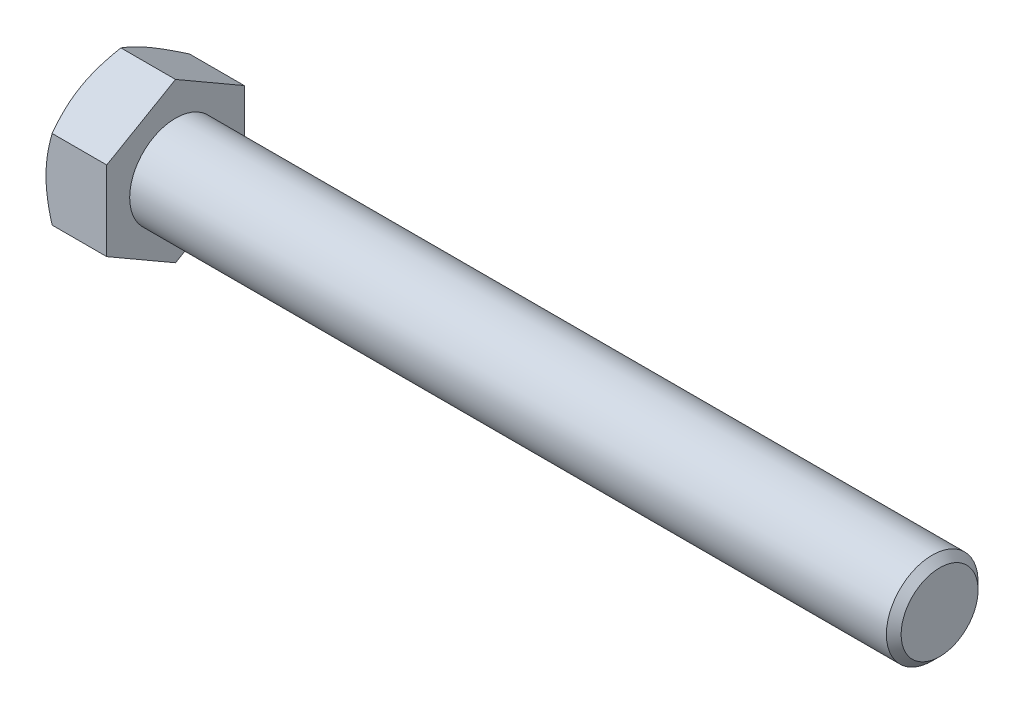
ISO-10303-21;
HEADER;
FILE_DESCRIPTION(('STEP AP214'),'2;1');
FILE_NAME('part.step','',(''),(''),'','','');
FILE_SCHEMA(('AUTOMOTIVE_DESIGN { 1 0 10303 214 1 1 1 1 }'));
ENDSEC;
DATA;
#1=APPLICATION_CONTEXT('core data for automotive mechanical design processes');
#2=APPLICATION_PROTOCOL_DEFINITION('international standard','automotive_design',2000,#1);
#3=PRODUCT_CONTEXT('',#1,'mechanical');
#4=PRODUCT('Part','Part','',(#3));
#5=PRODUCT_RELATED_PRODUCT_CATEGORY('part','',(#4));
#6=PRODUCT_DEFINITION_FORMATION('','',#4);
#7=PRODUCT_DEFINITION_CONTEXT('part definition',#1,'design');
#8=PRODUCT_DEFINITION('design','',#6,#7);
#9=PRODUCT_DEFINITION_SHAPE('','',#8);
#10=(LENGTH_UNIT() NAMED_UNIT(*) SI_UNIT(.MILLI.,.METRE.));
#11=(NAMED_UNIT(*) PLANE_ANGLE_UNIT() SI_UNIT($,.RADIAN.));
#12=(NAMED_UNIT(*) SI_UNIT($,.STERADIAN.) SOLID_ANGLE_UNIT());
#13=UNCERTAINTY_MEASURE_WITH_UNIT(LENGTH_MEASURE(1.E-05),#10,'distance_accuracy_value','');
#14=(GEOMETRIC_REPRESENTATION_CONTEXT(3) GLOBAL_UNCERTAINTY_ASSIGNED_CONTEXT((#13)) GLOBAL_UNIT_ASSIGNED_CONTEXT((#10,
#11,#12)) REPRESENTATION_CONTEXT('',''));
#15=CARTESIAN_POINT('',(0.,0.,0.));
#16=DIRECTION('',(0.,0.,1.));
#17=DIRECTION('',(1.,0.,0.));
#18=AXIS2_PLACEMENT_3D('',#15,#16,#17);
#19=CARTESIAN_POINT('',(7.95,5.19615242270662,-9.));
#20=DIRECTION('',(0.,-0.866025403784438,0.500000000000001));
#21=DIRECTION('',(0.,-0.500000000000001,-0.866025403784438));
#22=AXIS2_PLACEMENT_3D('',#19,#20,#21);
#23=PLANE('',#22);
#24=CARTESIAN_POINT('',(0.803914245071131,10.3924203154671,0.0002));
#25=CARTESIAN_POINT('',(0.737982001874053,10.2782163639798,-0.197607046401216));
#26=CARTESIAN_POINT('',(0.675041409210311,10.1635669787649,-0.396185606649945));
#27=CARTESIAN_POINT('',(0.555968997655535,9.93333715083391,-0.79495536604421));
#28=CARTESIAN_POINT('',(0.499840117752061,9.81775632901308,-0.995147221818451));
#29=CARTESIAN_POINT('',(0.39515196072896,9.58544915100228,-1.3975150570961));
#30=CARTESIAN_POINT('',(0.346610772912784,9.46872074181186,-1.5996945925006));
#31=CARTESIAN_POINT('',(0.258148516787918,9.23447001335913,-2.00542875589074));
#32=CARTESIAN_POINT('',(0.218225687483272,9.11694786135374,-2.20898309417891));
#33=CARTESIAN_POINT('',(0.148684674147113,8.88408932604662,-2.61230590830691));
#34=CARTESIAN_POINT('',(0.118837502847797,8.76877014301847,-2.812044592399));
#35=CARTESIAN_POINT('',(0.0687933098590791,8.53761579013205,-3.212415675989));
#36=CARTESIAN_POINT('',(0.0485954355375376,8.42178066677661,-3.41304799494161));
#37=CARTESIAN_POINT('',(0.0183543473973449,8.18990950036671,-3.81466063597382));
#38=CARTESIAN_POINT('',(0.00829960958430065,8.07387383570153,-4.01564030266393));
#39=CARTESIAN_POINT('',(-0.00143766485492029,7.84169571742973,-4.41778459991642));
#40=CARTESIAN_POINT('',(-0.00112052193524612,7.72555326723328,-4.61894922457222));
#41=CARTESIAN_POINT('',(0.00916395215317029,7.50842142195782,-4.9950326125305));
#42=CARTESIAN_POINT('',(0.0178767400303934,7.40741671639993,-5.16997789436029));
#43=CARTESIAN_POINT('',(0.0429773400653656,7.20564389241818,-5.51945867708335));
#44=CARTESIAN_POINT('',(0.0593656695806653,7.10487579040239,-5.69399414955697));
#45=CARTESIAN_POINT('',(0.119656556235826,6.80296159398079,-6.2169248772855));
#46=CARTESIAN_POINT('',(0.174677482341124,6.60234990505053,-6.56439451510491));
#47=CARTESIAN_POINT('',(0.312230476325147,6.1989985076226,-7.263019628754));
#48=CARTESIAN_POINT('',(0.395345618627103,5.99631027619252,-7.61408594368717));
#49=CARTESIAN_POINT('',(0.583982539436457,5.59395639760763,-8.3109833040186));
#50=CARTESIAN_POINT('',(0.689460012893352,5.39428559809852,-8.65682327355628));
#51=CARTESIAN_POINT('',(0.803914245071125,5.19603695265279,-9.0002));
#52=B_SPLINE_CURVE_WITH_KNOTS('',3,(#24,#25,#26,#27,#28,#29,#30,#31,#32,#33,#34,#35,#36,#37,#38,
#39,#40,#41,#42,#43,#44,#45,#46,#47,#48,#49,#50,#51),.UNSPECIFIED.,.F.,.F.,(4,2,2,2,2,2,2,2,2,2,
2,2,2,4),(0.,0.713219249102579,1.42674513853509,2.14194697262263,2.85700253034481,
3.55449749123034,4.25193080859215,4.94857085059645,5.64518936892663,6.25162976378284,
6.85811104066341,8.07193747617894,9.31268391793542,10.5509947443908),.UNSPECIFIED.);
#53=CARTESIAN_POINT('',(0.803847577293365,10.3923048454133,0.));
#54=VERTEX_POINT('',#53);
#55=CARTESIAN_POINT('',(0.,7.79422863405994,-4.50000000000001));
#56=VERTEX_POINT('',#55);
#57=EDGE_CURVE('E52',#54,#56,#52,.T.);
#58=ORIENTED_EDGE('',*,*,#57,.F.);
#59=DIRECTION('',(-1.,0.,0.));
#60=VECTOR('',#59,1.);
#61=CARTESIAN_POINT('',(7.95,10.3923048454133,0.));
#62=LINE('',#61,#60);
#63=CARTESIAN_POINT('',(7.95,10.3923048454133,0.));
#64=VERTEX_POINT('',#63);
#65=EDGE_CURVE('E148',#64,#54,#62,.T.);
#66=ORIENTED_EDGE('',*,*,#65,.F.);
#67=DIRECTION('',(0.,0.500000000000001,0.866025403784438));
#68=VECTOR('',#67,1.);
#69=CARTESIAN_POINT('',(7.95,5.19615242270662,-9.));
#70=LINE('',#69,#68);
#71=CARTESIAN_POINT('',(7.95,5.19615242270662,-9.));
#72=VERTEX_POINT('',#71);
#73=EDGE_CURVE('E233',#72,#64,#70,.T.);
#74=ORIENTED_EDGE('',*,*,#73,.F.);
#75=DIRECTION('',(-1.,0.,0.));
#76=VECTOR('',#75,1.);
#77=CARTESIAN_POINT('',(7.95,5.19615242270662,-9.));
#78=LINE('',#77,#76);
#79=CARTESIAN_POINT('',(0.80384757729336,5.19615242270662,-9.));
#80=VERTEX_POINT('',#79);
#81=EDGE_CURVE('E136',#72,#80,#78,.T.);
#82=ORIENTED_EDGE('',*,*,#81,.T.);
#83=EDGE_CURVE('E130',#56,#80,#52,.T.);
#84=ORIENTED_EDGE('',*,*,#83,.F.);
#85=EDGE_LOOP('',(#58,#66,#74,#82,#84));
#86=FACE_BOUND('',#85,.T.);
#87=ADVANCED_FACE('F36',(#86),#23,.F.);
#88=CARTESIAN_POINT('',(7.95,10.3923048454133,0.));
#89=DIRECTION('',(0.,-0.866025403784438,-0.500000000000001));
#90=DIRECTION('',(0.,0.500000000000001,-0.866025403784438));
#91=AXIS2_PLACEMENT_3D('',#88,#89,#90);
#92=PLANE('',#91);
#93=CARTESIAN_POINT('',(0.803914245071125,5.19603695265279,9.0002));
#94=CARTESIAN_POINT('',(0.737982001874048,5.31024090414013,8.80239295359879));
#95=CARTESIAN_POINT('',(0.675041409210306,5.42489028935502,8.60381439335006));
#96=CARTESIAN_POINT('',(0.55596899765553,5.65512011728599,8.20504463395579));
#97=CARTESIAN_POINT('',(0.499840117752056,5.77070093910681,8.00485277818155));
#98=CARTESIAN_POINT('',(0.395151960728956,6.00300811711761,7.6024849429039));
#99=CARTESIAN_POINT('',(0.34661077291278,6.11973652630803,7.4003054074994));
#100=CARTESIAN_POINT('',(0.258148516787915,6.35398725476076,6.99457124410926));
#101=CARTESIAN_POINT('',(0.218225687483269,6.47150940676615,6.79101690582109));
#102=CARTESIAN_POINT('',(0.14868467414711,6.70436794207327,6.38769409169309));
#103=CARTESIAN_POINT('',(0.118837502847796,6.81968712510142,6.187955407601));
#104=CARTESIAN_POINT('',(0.0687933098590778,7.05084147798785,5.78758432401101));
#105=CARTESIAN_POINT('',(0.0485954355375358,7.16667660134328,5.5869520050584));
#106=CARTESIAN_POINT('',(0.0183543473973432,7.39854776775318,5.18533936402619));
#107=CARTESIAN_POINT('',(0.00829960958429943,7.51458343241836,4.98435969733607));
#108=CARTESIAN_POINT('',(-0.00143766485492108,7.74676155069016,4.58221540008358));
#109=CARTESIAN_POINT('',(-0.00112052193524697,7.86290400088661,4.38105077542778));
#110=CARTESIAN_POINT('',(0.00916395215317057,8.08003584616207,4.0049673874695));
#111=CARTESIAN_POINT('',(0.0178767400303947,8.18104055171996,3.83002210563971));
#112=CARTESIAN_POINT('',(0.042977340065368,8.38281337570172,3.48054132291666));
#113=CARTESIAN_POINT('',(0.0593656695806676,8.4835814777175,3.30600585044303));
#114=CARTESIAN_POINT('',(0.119656556235828,8.7854956741391,2.7830751227145));
#115=CARTESIAN_POINT('',(0.174677482341128,8.98610736306936,2.43560548489509));
#116=CARTESIAN_POINT('',(0.312230476325151,9.38945876049729,1.736980371246));
#117=CARTESIAN_POINT('',(0.395345618627107,9.59214699192737,1.38591405631283));
#118=CARTESIAN_POINT('',(0.583982539436462,9.99450087051226,0.689016695981395));
#119=CARTESIAN_POINT('',(0.689460012893357,10.1941716700214,0.343176726443722));
#120=CARTESIAN_POINT('',(0.803914245071131,10.3924203154671,-0.000199999999999288));
#121=B_SPLINE_CURVE_WITH_KNOTS('',3,(#93,#94,#95,#96,#97,#98,#99,#100,#101,#102,#103,#104,#105,
#106,#107,#108,#109,#110,#111,#112,#113,#114,#115,#116,#117,#118,#119,#120),.UNSPECIFIED.,.F.,
.F.,(4,2,2,2,2,2,2,2,2,2,2,2,2,4),(0.,0.713219249102575,1.42674513853509,2.14194697262263,
2.8570025303448,3.55449749123034,4.25193080859215,4.94857085059645,5.64518936892662,
6.25162976378284,6.85811104066341,8.07193747617894,9.31268391793542,10.5509947443908),.UNSPECIFIED.);
#122=CARTESIAN_POINT('',(0.80384757729336,5.19615242270662,9.));
#123=VERTEX_POINT('',#122);
#124=CARTESIAN_POINT('',(0.,7.79422863405994,4.50000000000001));
#125=VERTEX_POINT('',#124);
#126=EDGE_CURVE('E59',#123,#125,#121,.T.);
#127=ORIENTED_EDGE('',*,*,#126,.F.);
#128=DIRECTION('',(-1.,0.,0.));
#129=VECTOR('',#128,1.);
#130=CARTESIAN_POINT('',(7.95,5.19615242270662,9.));
#131=LINE('',#130,#129);
#132=CARTESIAN_POINT('',(7.95,5.19615242270662,9.));
#133=VERTEX_POINT('',#132);
#134=EDGE_CURVE('E146',#133,#123,#131,.T.);
#135=ORIENTED_EDGE('',*,*,#134,.F.);
#136=DIRECTION('',(0.,-0.500000000000001,0.866025403784438));
#137=VECTOR('',#136,1.);
#138=CARTESIAN_POINT('',(7.95,10.3923048454133,0.));
#139=LINE('',#138,#137);
#140=EDGE_CURVE('E231',#64,#133,#139,.T.);
#141=ORIENTED_EDGE('',*,*,#140,.F.);
#142=ORIENTED_EDGE('',*,*,#65,.T.);
#143=EDGE_CURVE('E163',#125,#54,#121,.T.);
#144=ORIENTED_EDGE('',*,*,#143,.F.);
#145=EDGE_LOOP('',(#127,#135,#141,#142,#144));
#146=FACE_BOUND('',#145,.T.);
#147=ADVANCED_FACE('F169',(#146),#92,.F.);
#148=CARTESIAN_POINT('',(7.95,5.19615242270662,9.));
#149=DIRECTION('',(0.,0.,-1.));
#150=DIRECTION('',(0.,1.,0.));
#151=AXIS2_PLACEMENT_3D('',#148,#149,#150);
#152=PLANE('',#151);
#153=CARTESIAN_POINT('',(4.50308345116275,-14.1853984650015,9.));
#154=CARTESIAN_POINT('',(4.31054430443782,-13.7903499522351,9.));
#155=CARTESIAN_POINT('',(4.11978647586972,-13.3944187196266,9.));
#156=CARTESIAN_POINT('',(3.74283090620236,-12.6003222266755,9.));
#157=CARTESIAN_POINT('',(3.55663384146592,-12.2021566456113,9.));
#158=CARTESIAN_POINT('',(3.18890856344588,-11.4011783965729,9.));
#159=CARTESIAN_POINT('',(3.00740939067649,-10.9983523517115,9.));
#160=CARTESIAN_POINT('',(2.65153988681448,-10.1895752665153,9.));
#161=CARTESIAN_POINT('',(2.47716923358452,-9.78362436837963,9.));
#162=CARTESIAN_POINT('',(2.1316124492693,-8.953981891894,9.));
#163=CARTESIAN_POINT('',(1.96074001408348,-8.53015895315933,9.));
#164=CARTESIAN_POINT('',(1.63138410023259,-7.67764040403061,9.));
#165=CARTESIAN_POINT('',(1.47290197976961,-7.24894426532904,9.));
#166=CARTESIAN_POINT('',(1.17232155137939,-6.38672363138015,9.));
#167=CARTESIAN_POINT('',(1.0301919447447,-5.95321016213059,9.));
#168=CARTESIAN_POINT('',(0.766724668389701,-5.07998336095625,9.));
#169=CARTESIAN_POINT('',(0.645380685452063,-4.64027195560255,9.));
#170=CARTESIAN_POINT('',(0.429822600041207,-3.75682505769697,9.));
#171=CARTESIAN_POINT('',(0.335452586446509,-3.31312863828557,9.));
#172=CARTESIAN_POINT('',(0.218090109997791,-2.6433671330566,9.));
#173=CARTESIAN_POINT('',(0.1829998621584,-2.41939560703653,9.));
#174=CARTESIAN_POINT('',(0.121565667357827,-1.97026354386691,9.));
#175=CARTESIAN_POINT('',(0.0952208701204427,-1.74510312447118,9.));
#176=CARTESIAN_POINT('',(0.0521451472278593,-1.29693480879161,9.));
#177=CARTESIAN_POINT('',(0.0352889798642657,-1.07393900194961,9.));
#178=CARTESIAN_POINT('',(0.0110310639342766,-0.627433600763147,9.));
#179=CARTESIAN_POINT('',(0.00362915208926271,-0.403924015358625,9.));
#180=CARTESIAN_POINT('',(-0.00154262379217598,0.0432079361744945,9.));
#181=CARTESIAN_POINT('',(0.000687480645622839,0.266830301931565,9.));
#182=CARTESIAN_POINT('',(0.014722607723449,0.713776872824067,9.));
#183=CARTESIAN_POINT('',(0.0265280659472993,0.937101063932574,9.));
#184=CARTESIAN_POINT('',(0.0656502898571848,1.46707211896635,9.));
#185=CARTESIAN_POINT('',(0.0971347677291191,1.77341845056801,9.));
#186=CARTESIAN_POINT('',(0.176454333238004,2.38397028008966,9.));
#187=CARTESIAN_POINT('',(0.224291457717822,2.68817550649949,9.));
#188=CARTESIAN_POINT('',(0.389806402965324,3.59715813116675,9.));
#189=CARTESIAN_POINT('',(0.529461896846414,4.19799412652232,9.));
#190=CARTESIAN_POINT('',(0.77333187184897,5.09670706348811,9.));
#191=CARTESIAN_POINT('',(0.86153243114263,5.39919910543195,9.));
#192=CARTESIAN_POINT('',(1.04752099203163,6.00125026101995,9.));
#193=CARTESIAN_POINT('',(1.14530906206943,6.30080935370985,9.));
#194=CARTESIAN_POINT('',(1.34886866039496,6.89708058771341,9.));
#195=CARTESIAN_POINT('',(1.45463787690011,7.19379352557787,9.));
#196=CARTESIAN_POINT('',(1.6728730196874,7.78473287386444,9.));
#197=CARTESIAN_POINT('',(1.78533883473293,8.0789593254967,9.));
#198=CARTESIAN_POINT('',(2.07523735271454,8.81619444901849,9.));
#199=CARTESIAN_POINT('',(2.25629467011385,9.25777584408896,9.));
#200=CARTESIAN_POINT('',(2.62827522263086,10.1367776511577,9.));
#201=CARTESIAN_POINT('',(2.81919928705198,10.5741977097237,9.));
#202=CARTESIAN_POINT('',(3.20877963371492,11.4457286497122,9.));
#203=CARTESIAN_POINT('',(3.40743823107647,11.8798384930871,9.));
#204=CARTESIAN_POINT('',(3.81079737205718,12.7452179469075,9.));
#205=CARTESIAN_POINT('',(4.01549773502308,13.1764876418049,9.));
#206=CARTESIAN_POINT('',(4.43000777500988,14.0372827141758,9.));
#207=CARTESIAN_POINT('',(4.63982402220294,14.466804921625,9.));
#208=CARTESIAN_POINT('',(5.06336871339291,15.3239162694583,9.));
#209=CARTESIAN_POINT('',(5.27709718099328,15.7515053981603,9.));
#210=CARTESIAN_POINT('',(5.70771289609102,16.6049951424422,9.));
#211=CARTESIAN_POINT('',(5.92459958876705,17.0308960382694,9.));
#212=CARTESIAN_POINT('',(6.36101693257489,17.8813418239716,9.));
#213=CARTESIAN_POINT('',(6.58054759472945,18.305886708184,9.));
#214=CARTESIAN_POINT('',(7.20096689356043,19.4981240117253,9.));
#215=CARTESIAN_POINT('',(7.60436223424865,20.2645118375987,9.));
#216=CARTESIAN_POINT('',(8.41646747703505,21.7945065925678,9.));
#217=CARTESIAN_POINT('',(8.825177632206,22.558113387008,9.));
#218=CARTESIAN_POINT('',(9.64538992118459,24.08088542414,9.));
#219=CARTESIAN_POINT('',(10.0568800806834,24.8400571209878,9.));
#220=CARTESIAN_POINT('',(10.6764233675492,25.9775231898088,9.));
#221=CARTESIAN_POINT('',(10.8833155902988,26.3564507889065,9.));
#222=CARTESIAN_POINT('',(11.2977907102886,27.1139273756374,9.));
#223=CARTESIAN_POINT('',(11.5053736065156,27.4924763638249,9.));
#224=CARTESIAN_POINT('',(11.7132605802833,27.8708583347744,9.));
#225=B_SPLINE_CURVE_WITH_KNOTS('',3,(#153,#154,#155,#156,#157,#158,#159,#160,#161,#162,#163,
#164,#165,#166,#167,#168,#169,#170,#171,#172,#173,#174,#175,#176,#177,#178,#179,#180,#181,#182,
#183,#184,#185,#186,#187,#188,#189,#190,#191,#192,#193,#194,#195,#196,#197,#198,#199,#200,#201,
#202,#203,#204,#205,#206,#207,#208,#209,#210,#211,#212,#213,#214,#215,#216,#217,#218,#219,#220,
#221,#222,#223,#224),.UNSPECIFIED.,.F.,.F.,(4,2,2,2,2,2,2,2,2,2,2,2,2,2,2,2,2,2,2,2,2,2,2,2,2,2,
2,2,2,2,2,2,2,2,2,4),(0.,1.31842765114838,2.6370496560634,3.96247407620814,5.28783853415267,
6.65860358746618,8.02951869129602,9.39776460603692,10.7655942037287,12.1253499441535,
12.8053173169584,13.4852185605779,14.1559216013657,14.8266130586982,15.4973023208461,
16.1680220944284,17.0913849082023,18.0148627755644,19.862742604473,20.8079230410616,
21.75311022551,22.6980246745777,23.6429234321322,25.0745302305723,26.5062575523684,
27.9384167676661,29.3705332036396,30.8045973553514,32.2386701620091,33.6724940065179,
35.1063238307243,37.7045032490066,40.3028068397952,42.8933552129342,44.1885437295509,
45.4837303472313),.UNSPECIFIED.);
#226=CARTESIAN_POINT('',(0.803847577293355,-5.19615242270661,9.));
#227=VERTEX_POINT('',#226);
#228=CARTESIAN_POINT('',(0.,0.,9.));
#229=VERTEX_POINT('',#228);
#230=EDGE_CURVE('E243',#227,#229,#225,.T.);
#231=ORIENTED_EDGE('',*,*,#230,.F.);
#232=DIRECTION('',(-1.,0.,0.));
#233=VECTOR('',#232,1.);
#234=CARTESIAN_POINT('',(7.95,-5.19615242270661,9.));
#235=LINE('',#234,#233);
#236=CARTESIAN_POINT('',(7.95,-5.19615242270661,9.));
#237=VERTEX_POINT('',#236);
#238=EDGE_CURVE('E138',#237,#227,#235,.T.);
#239=ORIENTED_EDGE('',*,*,#238,.F.);
#240=DIRECTION('',(0.,-1.,0.));
#241=VECTOR('',#240,1.);
#242=CARTESIAN_POINT('',(7.95,5.19615242270662,9.));
#243=LINE('',#242,#241);
#244=EDGE_CURVE('E227',#133,#237,#243,.T.);
#245=ORIENTED_EDGE('',*,*,#244,.F.);
#246=ORIENTED_EDGE('',*,*,#134,.T.);
#247=EDGE_CURVE('E185',#229,#123,#225,.T.);
#248=ORIENTED_EDGE('',*,*,#247,.F.);
#249=EDGE_LOOP('',(#231,#239,#245,#246,#248));
#250=FACE_BOUND('',#249,.T.);
#251=ADVANCED_FACE('F249',(#250),#152,.F.);
#252=CARTESIAN_POINT('',(7.95,-10.3923048454133,0.));
#253=DIRECTION('',(0.,0.866025403784438,-0.500000000000002));
#254=DIRECTION('',(0.,0.500000000000002,0.866025403784438));
#255=AXIS2_PLACEMENT_3D('',#252,#253,#254);
#256=PLANE('',#255);
#257=CARTESIAN_POINT('',(0.803914245071131,-10.3924203154671,-0.000200000000000038));
#258=CARTESIAN_POINT('',(0.737982001874052,-10.2782163639798,0.197607046401216));
#259=CARTESIAN_POINT('',(0.67504140921031,-10.1635669787649,0.396185606649944));
#260=CARTESIAN_POINT('',(0.555968997655534,-9.93333715083391,0.794955366044208));
#261=CARTESIAN_POINT('',(0.49984011775206,-9.81775632901308,0.995147221818448));
#262=CARTESIAN_POINT('',(0.39515196072896,-9.58544915100228,1.39751505709609));
#263=CARTESIAN_POINT('',(0.346610772912783,-9.46872074181186,1.59969459250059));
#264=CARTESIAN_POINT('',(0.258148516787917,-9.23447001335913,2.00542875589074));
#265=CARTESIAN_POINT('',(0.21822568748327,-9.11694786135374,2.20898309417891));
#266=CARTESIAN_POINT('',(0.14868467414711,-8.88408932604662,2.61230590830691));
#267=CARTESIAN_POINT('',(0.118837502847796,-8.76877014301847,2.812044592399));
#268=CARTESIAN_POINT('',(0.0687933098590775,-8.53761579013204,3.21241567598899));
#269=CARTESIAN_POINT('',(0.048595435537535,-8.42178066677661,3.4130479949416));
#270=CARTESIAN_POINT('',(0.018354347397342,-8.18990950036671,3.81466063597381));
#271=CARTESIAN_POINT('',(0.00829960958429835,-8.07387383570153,4.01564030266393));
#272=CARTESIAN_POINT('',(-0.00143766485492302,-7.84169571742973,4.41778459991642));
#273=CARTESIAN_POINT('',(-0.00112052193524985,-7.72555326723327,4.61894922457222));
#274=CARTESIAN_POINT('',(0.00916395215316603,-7.50842142195781,4.99503261253049));
#275=CARTESIAN_POINT('',(0.0178767400303894,-7.40741671639993,5.16997789436028));
#276=CARTESIAN_POINT('',(0.0429773400653618,-7.20564389241817,5.51945867708334));
#277=CARTESIAN_POINT('',(0.0593656695806615,-7.10487579040238,5.69399414955696));
#278=CARTESIAN_POINT('',(0.119656556235822,-6.80296159398079,6.2169248772855));
#279=CARTESIAN_POINT('',(0.17467748234112,-6.60234990505053,6.56439451510491));
#280=CARTESIAN_POINT('',(0.312230476325142,-6.19899850762259,7.263019628754));
#281=CARTESIAN_POINT('',(0.395345618627098,-5.99631027619251,7.61408594368717));
#282=CARTESIAN_POINT('',(0.583982539436452,-5.59395639760762,8.3109833040186));
#283=CARTESIAN_POINT('',(0.689460012893347,-5.39428559809851,8.65682327355628));
#284=CARTESIAN_POINT('',(0.803914245071121,-5.19603695265277,9.0002));
#285=B_SPLINE_CURVE_WITH_KNOTS('',3,(#257,#258,#259,#260,#261,#262,#263,#264,#265,#266,#267,
#268,#269,#270,#271,#272,#273,#274,#275,#276,#277,#278,#279,#280,#281,#282,#283,#284),
.UNSPECIFIED.,.F.,.F.,(4,2,2,2,2,2,2,2,2,2,2,2,2,4),(0.,0.713219249102577,1.42674513853509,
2.14194697262263,2.8570025303448,3.55449749123034,4.25193080859215,4.94857085059645,
5.64518936892663,6.25162976378284,6.85811104066341,8.07193747617895,9.31268391793542,
10.5509947443908),.UNSPECIFIED.);
#286=CARTESIAN_POINT('',(0.803847577293366,-10.3923048454133,0.));
#287=VERTEX_POINT('',#286);
#288=CARTESIAN_POINT('',(0.,-7.79422863405994,4.50000000000002));
#289=VERTEX_POINT('',#288);
#290=EDGE_CURVE('E171',#287,#289,#285,.T.);
#291=ORIENTED_EDGE('',*,*,#290,.F.);
#292=DIRECTION('',(-1.,0.,0.));
#293=VECTOR('',#292,1.);
#294=CARTESIAN_POINT('',(7.95,-10.3923048454133,0.));
#295=LINE('',#294,#293);
#296=CARTESIAN_POINT('',(7.95,-10.3923048454133,0.));
#297=VERTEX_POINT('',#296);
#298=EDGE_CURVE('E135',#297,#287,#295,.T.);
#299=ORIENTED_EDGE('',*,*,#298,.F.);
#300=DIRECTION('',(0.,-0.500000000000002,-0.866025403784437));
#301=VECTOR('',#300,1.);
#302=CARTESIAN_POINT('',(7.95,-10.3923048454133,0.));
#303=LINE('',#302,#301);
#304=EDGE_CURVE('E225',#237,#297,#303,.T.);
#305=ORIENTED_EDGE('',*,*,#304,.F.);
#306=ORIENTED_EDGE('',*,*,#238,.T.);
#307=EDGE_CURVE('E173',#289,#227,#285,.T.);
#308=ORIENTED_EDGE('',*,*,#307,.F.);
#309=EDGE_LOOP('',(#291,#299,#305,#306,#308));
#310=FACE_BOUND('',#309,.T.);
#311=ADVANCED_FACE('F221',(#310),#256,.F.);
#312=CARTESIAN_POINT('',(7.95,-5.19615242270664,-9.));
#313=DIRECTION('',(0.,0.866025403784439,0.5));
#314=DIRECTION('',(0.,-0.5,0.866025403784439));
#315=AXIS2_PLACEMENT_3D('',#312,#313,#314);
#316=PLANE('',#315);
#317=CARTESIAN_POINT('',(0.80391424507113,-5.1960369526528,-9.0002));
#318=CARTESIAN_POINT('',(0.737982001874052,-5.31024090414015,-8.80239295359878));
#319=CARTESIAN_POINT('',(0.67504140921031,-5.42489028935504,-8.60381439335005));
#320=CARTESIAN_POINT('',(0.555968997655534,-5.655120117286,-8.20504463395579));
#321=CARTESIAN_POINT('',(0.49984011775206,-5.77070093910683,-8.00485277818155));
#322=CARTESIAN_POINT('',(0.39515196072896,-6.00300811711763,-7.6024849429039));
#323=CARTESIAN_POINT('',(0.346610772912784,-6.11973652630805,-7.4003054074994));
#324=CARTESIAN_POINT('',(0.258148516787919,-6.35398725476078,-6.99457124410925));
#325=CARTESIAN_POINT('',(0.218225687483273,-6.47150940676616,-6.79101690582109));
#326=CARTESIAN_POINT('',(0.148684674147114,-6.70436794207329,-6.38769409169308));
#327=CARTESIAN_POINT('',(0.1188375028478,-6.81968712510144,-6.18795540760099));
#328=CARTESIAN_POINT('',(0.0687933098590818,-7.05084147798786,-5.787584324011));
#329=CARTESIAN_POINT('',(0.0485954355375395,-7.16667660134329,-5.58695200505839));
#330=CARTESIAN_POINT('',(0.018354347397347,-7.39854776775319,-5.18533936402618));
#331=CARTESIAN_POINT('',(0.00829960958430379,-7.51458343241837,-4.98435969733606));
#332=CARTESIAN_POINT('',(-0.00143766485491643,-7.74676155069017,-4.58221540008357));
#333=CARTESIAN_POINT('',(-0.00112052193524256,-7.86290400088662,-4.38105077542778));
#334=CARTESIAN_POINT('',(0.00916395215317421,-8.08003584616208,-4.0049673874695));
#335=CARTESIAN_POINT('',(0.0178767400303979,-8.18104055171997,-3.83002210563971));
#336=CARTESIAN_POINT('',(0.0429773400653709,-8.38281337570172,-3.48054132291665));
#337=CARTESIAN_POINT('',(0.0593656695806708,-8.48358147771751,-3.30600585044303));
#338=CARTESIAN_POINT('',(0.119656556235832,-8.7854956741391,-2.78307512271449));
#339=CARTESIAN_POINT('',(0.17467748234113,-8.98610736306936,-2.43560548489509));
#340=CARTESIAN_POINT('',(0.312230476325151,-9.38945876049729,-1.736980371246));
#341=CARTESIAN_POINT('',(0.395345618627107,-9.59214699192737,-1.38591405631283));
#342=CARTESIAN_POINT('',(0.583982539436462,-9.99450087051226,-0.689016695981394));
#343=CARTESIAN_POINT('',(0.689460012893357,-10.1941716700214,-0.34317672644372));
#344=CARTESIAN_POINT('',(0.803914245071131,-10.3924203154671,0.000200000000000045));
#345=B_SPLINE_CURVE_WITH_KNOTS('',3,(#317,#318,#319,#320,#321,#322,#323,#324,#325,#326,#327,
#328,#329,#330,#331,#332,#333,#334,#335,#336,#337,#338,#339,#340,#341,#342,#343,#344),
.UNSPECIFIED.,.F.,.F.,(4,2,2,2,2,2,2,2,2,2,2,2,2,4),(0.,0.713219249102579,1.42674513853509,
2.14194697262263,2.85700253034481,3.55449749123034,4.25193080859215,4.94857085059645,
5.64518936892663,6.25162976378284,6.85811104066341,8.07193747617894,9.31268391793541,
10.5509947443908),.UNSPECIFIED.);
#346=CARTESIAN_POINT('',(0.803847577293109,-5.19615242270702,-9.));
#347=VERTEX_POINT('',#346);
#348=CARTESIAN_POINT('',(0.,-7.79422863405995,-4.5));
#349=VERTEX_POINT('',#348);
#350=EDGE_CURVE('E112',#347,#349,#345,.T.);
#351=ORIENTED_EDGE('',*,*,#350,.F.);
#352=DIRECTION('',(-1.,0.,0.));
#353=VECTOR('',#352,1.);
#354=CARTESIAN_POINT('',(7.95,-5.19615242270664,-9.));
#355=LINE('',#354,#353);
#356=CARTESIAN_POINT('',(7.95,-5.19615242270664,-9.));
#357=VERTEX_POINT('',#356);
#358=EDGE_CURVE('E126',#357,#347,#355,.T.);
#359=ORIENTED_EDGE('',*,*,#358,.F.);
#360=DIRECTION('',(0.,0.5,-0.866025403784439));
#361=VECTOR('',#360,1.);
#362=CARTESIAN_POINT('',(7.95,-5.19615242270664,-9.));
#363=LINE('',#362,#361);
#364=EDGE_CURVE('E223',#297,#357,#363,.T.);
#365=ORIENTED_EDGE('',*,*,#364,.F.);
#366=ORIENTED_EDGE('',*,*,#298,.T.);
#367=EDGE_CURVE('E129',#349,#287,#345,.T.);
#368=ORIENTED_EDGE('',*,*,#367,.F.);
#369=EDGE_LOOP('',(#351,#359,#365,#366,#368));
#370=FACE_BOUND('',#369,.T.);
#371=ADVANCED_FACE('F124',(#370),#316,.F.);
#372=CARTESIAN_POINT('',(7.95,5.19615242270662,-9.));
#373=DIRECTION('',(0.,0.,1.));
#374=DIRECTION('',(1.,0.,0.));
#375=AXIS2_PLACEMENT_3D('',#372,#373,#374);
#376=PLANE('',#375);
#377=CARTESIAN_POINT('',(4.50308345116277,-14.1853984650015,-9.));
#378=CARTESIAN_POINT('',(4.31054430443784,-13.7903499522352,-9.));
#379=CARTESIAN_POINT('',(4.11978647586973,-13.3944187196266,-9.));
#380=CARTESIAN_POINT('',(3.74283090620237,-12.6003222266755,-9.));
#381=CARTESIAN_POINT('',(3.55663384146594,-12.2021566456113,-9.));
#382=CARTESIAN_POINT('',(3.1889085634459,-11.4011783965729,-9.));
#383=CARTESIAN_POINT('',(3.00740939067651,-10.9983523517116,-9.));
#384=CARTESIAN_POINT('',(2.65153988681449,-10.1895752665153,-9.));
#385=CARTESIAN_POINT('',(2.47716923358453,-9.78362436837965,-9.));
#386=CARTESIAN_POINT('',(2.13161244926931,-8.95398189189403,-9.));
#387=CARTESIAN_POINT('',(1.96074001408349,-8.53015895315935,-9.));
#388=CARTESIAN_POINT('',(1.6313841002326,-7.67764040403063,-9.));
#389=CARTESIAN_POINT('',(1.47290197976962,-7.24894426532906,-9.));
#390=CARTESIAN_POINT('',(1.1723215513794,-6.38672363138017,-9.));
#391=CARTESIAN_POINT('',(1.03019194474471,-5.95321016213062,-9.));
#392=CARTESIAN_POINT('',(0.766724668389708,-5.07998336095627,-9.));
#393=CARTESIAN_POINT('',(0.645380685452069,-4.64027195560257,-9.));
#394=CARTESIAN_POINT('',(0.429822600041212,-3.75682505769699,-9.));
#395=CARTESIAN_POINT('',(0.335452586446514,-3.31312863828559,-9.));
#396=CARTESIAN_POINT('',(0.218090109997794,-2.64336713305662,-9.));
#397=CARTESIAN_POINT('',(0.182999862158403,-2.41939560703655,-9.));
#398=CARTESIAN_POINT('',(0.12156566735783,-1.97026354386692,-9.));
#399=CARTESIAN_POINT('',(0.0952208701204455,-1.7451031244712,-9.));
#400=CARTESIAN_POINT('',(0.0521451472278617,-1.29693480879163,-9.));
#401=CARTESIAN_POINT('',(0.0352889798642676,-1.07393900194963,-9.));
#402=CARTESIAN_POINT('',(0.0110310639342778,-0.627433600763166,-9.));
#403=CARTESIAN_POINT('',(0.00362915208926362,-0.403924015358644,-9.));
#404=CARTESIAN_POINT('',(-0.00154262379217586,0.0432079361744755,-9.));
#405=CARTESIAN_POINT('',(0.00068748064562245,0.266830301931546,-9.));
#406=CARTESIAN_POINT('',(0.0147226077234483,0.713776872824048,-9.));
#407=CARTESIAN_POINT('',(0.0265280659472989,0.937101063932556,-9.));
#408=CARTESIAN_POINT('',(0.0656502898571838,1.46707211896633,-9.));
#409=CARTESIAN_POINT('',(0.097134767729117,1.77341845056799,-9.));
#410=CARTESIAN_POINT('',(0.176454333238001,2.38397028008964,-9.));
#411=CARTESIAN_POINT('',(0.224291457717819,2.68817550649947,-9.));
#412=CARTESIAN_POINT('',(0.389806402965321,3.59715813116673,-9.));
#413=CARTESIAN_POINT('',(0.529461896846409,4.19799412652229,-9.));
#414=CARTESIAN_POINT('',(0.773331871848963,5.09670706348808,-9.));
#415=CARTESIAN_POINT('',(0.861532431142623,5.39919910543193,-9.));
#416=CARTESIAN_POINT('',(1.04752099203162,6.00125026101993,-9.));
#417=CARTESIAN_POINT('',(1.14530906206942,6.30080935370982,-9.));
#418=CARTESIAN_POINT('',(1.34886866039495,6.89708058771339,-9.));
#419=CARTESIAN_POINT('',(1.4546378769001,7.19379352557784,-9.));
#420=CARTESIAN_POINT('',(1.67287301968739,7.78473287386441,-9.));
#421=CARTESIAN_POINT('',(1.78533883473292,8.07895932549667,-9.));
#422=CARTESIAN_POINT('',(2.07523735271453,8.81619444901847,-9.));
#423=CARTESIAN_POINT('',(2.25629467011384,9.25777584408894,-9.));
#424=CARTESIAN_POINT('',(2.62827522263086,10.1367776511577,-9.));
#425=CARTESIAN_POINT('',(2.81919928705197,10.5741977097237,-9.));
#426=CARTESIAN_POINT('',(3.20877963371491,11.4457286497122,-9.));
#427=CARTESIAN_POINT('',(3.40743823107646,11.8798384930871,-9.));
#428=CARTESIAN_POINT('',(3.81079737205717,12.7452179469075,-9.));
#429=CARTESIAN_POINT('',(4.01549773502307,13.1764876418049,-9.));
#430=CARTESIAN_POINT('',(4.43000777500987,14.0372827141757,-9.));
#431=CARTESIAN_POINT('',(4.63982402220294,14.466804921625,-9.));
#432=CARTESIAN_POINT('',(5.0633687133929,15.3239162694583,-9.));
#433=CARTESIAN_POINT('',(5.27709718099328,15.7515053981603,-9.));
#434=CARTESIAN_POINT('',(5.70771289609102,16.6049951424422,-9.));
#435=CARTESIAN_POINT('',(5.92459958876704,17.0308960382694,-9.));
#436=CARTESIAN_POINT('',(6.36101693257489,17.8813418239716,-9.));
#437=CARTESIAN_POINT('',(6.58054759472945,18.305886708184,-9.));
#438=CARTESIAN_POINT('',(7.20096689356043,19.4981240117253,-9.));
#439=CARTESIAN_POINT('',(7.60436223424865,20.2645118375987,-9.));
#440=CARTESIAN_POINT('',(8.41646747703506,21.7945065925678,-9.));
#441=CARTESIAN_POINT('',(8.82517763220601,22.558113387008,-9.));
#442=CARTESIAN_POINT('',(9.6453899211846,24.08088542414,-9.));
#443=CARTESIAN_POINT('',(10.0568800806834,24.8400571209878,-9.));
#444=CARTESIAN_POINT('',(10.6764233675492,25.9775231898088,-9.));
#445=CARTESIAN_POINT('',(10.8833155902988,26.3564507889065,-9.));
#446=CARTESIAN_POINT('',(11.2977907102886,27.1139273756374,-9.));
#447=CARTESIAN_POINT('',(11.5053736065156,27.492476363825,-9.));
#448=CARTESIAN_POINT('',(11.7132605802833,27.8708583347745,-9.));
#449=B_SPLINE_CURVE_WITH_KNOTS('',3,(#377,#378,#379,#380,#381,#382,#383,#384,#385,#386,#387,
#388,#389,#390,#391,#392,#393,#394,#395,#396,#397,#398,#399,#400,#401,#402,#403,#404,#405,#406,
#407,#408,#409,#410,#411,#412,#413,#414,#415,#416,#417,#418,#419,#420,#421,#422,#423,#424,#425,
#426,#427,#428,#429,#430,#431,#432,#433,#434,#435,#436,#437,#438,#439,#440,#441,#442,#443,#444,
#445,#446,#447,#448),.UNSPECIFIED.,.F.,.F.,(4,2,2,2,2,2,2,2,2,2,2,2,2,2,2,2,2,2,2,2,2,2,2,2,2,2,
2,2,2,2,2,2,2,2,2,4),(0.,1.31842765114838,2.6370496560634,3.96247407620815,5.28783853415268,
6.65860358746619,8.02951869129603,9.39776460603693,10.7655942037288,12.1253499441535,
12.8053173169584,13.485218560578,14.1559216013657,14.8266130586982,15.4973023208461,
16.1680220944284,17.0913849082023,18.0148627755644,19.862742604473,20.8079230410616,
21.75311022551,22.6980246745778,23.6429234321322,25.0745302305723,26.5062575523684,
27.9384167676661,29.3705332036396,30.8045973553514,32.2386701620091,33.6724940065179,
35.1063238307244,37.7045032490067,40.3028068397952,42.8933552129343,44.1885437295509,
45.4837303472314),.UNSPECIFIED.);
#450=CARTESIAN_POINT('',(0.,0.,-9.));
#451=VERTEX_POINT('',#450);
#452=EDGE_CURVE('E118',#80,#451,#449,.F.);
#453=ORIENTED_EDGE('',*,*,#452,.F.);
#454=ORIENTED_EDGE('',*,*,#81,.F.);
#455=DIRECTION('',(0.,1.,0.));
#456=VECTOR('',#455,1.);
#457=CARTESIAN_POINT('',(7.95,5.19615242270662,-9.));
#458=LINE('',#457,#456);
#459=EDGE_CURVE('E134',#357,#72,#458,.T.);
#460=ORIENTED_EDGE('',*,*,#459,.F.);
#461=ORIENTED_EDGE('',*,*,#358,.T.);
#462=EDGE_CURVE('E109',#451,#347,#449,.F.);
#463=ORIENTED_EDGE('',*,*,#462,.F.);
#464=EDGE_LOOP('',(#453,#454,#460,#461,#463));
#465=FACE_BOUND('',#464,.T.);
#466=ADVANCED_FACE('F132',(#465),#376,.F.);
#467=CARTESIAN_POINT('',(7.95,10.3923048454133,0.));
#468=DIRECTION('',(1.,0.,0.));
#469=DIRECTION('',(0.,0.,-1.));
#470=AXIS2_PLACEMENT_3D('',#467,#468,#469);
#471=PLANE('',#470);
#472=ORIENTED_EDGE('',*,*,#73,.T.);
#473=ORIENTED_EDGE('',*,*,#140,.T.);
#474=ORIENTED_EDGE('',*,*,#244,.T.);
#475=ORIENTED_EDGE('',*,*,#304,.T.);
#476=ORIENTED_EDGE('',*,*,#364,.T.);
#477=ORIENTED_EDGE('',*,*,#459,.T.);
#478=EDGE_LOOP('',(#472,#473,#474,#475,#476,#477));
#479=FACE_BOUND('',#478,.T.);
#480=CARTESIAN_POINT('',(7.95,0.,0.));
#481=DIRECTION('',(1.,0.,0.));
#482=DIRECTION('',(0.,0.,-1.));
#483=AXIS2_PLACEMENT_3D('',#480,#481,#482);
#484=CIRCLE('',#483,6.);
#485=CARTESIAN_POINT('',(7.95,0.,-6.));
#486=VERTEX_POINT('',#485);
#487=EDGE_CURVE('E236',#486,#486,#484,.F.);
#488=ORIENTED_EDGE('',*,*,#487,.T.);
#489=EDGE_LOOP('',(#488));
#490=FACE_BOUND('',#489,.T.);
#491=ADVANCED_FACE('F251',(#479,#490),#471,.T.);
#492=CARTESIAN_POINT('',(0.,0.,0.));
#493=DIRECTION('',(-1.,0.,0.));
#494=DIRECTION('',(0.,0.,1.));
#495=AXIS2_PLACEMENT_3D('',#492,#493,#494);
#496=CYLINDRICAL_SURFACE('',#495,6.);
#497=ORIENTED_EDGE('',*,*,#487,.F.);
#498=EDGE_LOOP('',(#497));
#499=FACE_BOUND('',#498,.T.);
#500=CARTESIAN_POINT('',(106.986,0.,0.));
#501=DIRECTION('',(-1.,0.,0.));
#502=DIRECTION('',(0.,0.,1.));
#503=AXIS2_PLACEMENT_3D('',#500,#501,#502);
#504=CIRCLE('',#503,6.);
#505=CARTESIAN_POINT('',(106.986,0.,6.));
#506=VERTEX_POINT('',#505);
#507=EDGE_CURVE('E239',#506,#506,#504,.T.);
#508=ORIENTED_EDGE('',*,*,#507,.T.);
#509=EDGE_LOOP('',(#508));
#510=FACE_BOUND('',#509,.T.);
#511=ADVANCED_FACE('F283',(#499,#510),#496,.T.);
#512=CARTESIAN_POINT('',(107.95,0.,0.));
#513=DIRECTION('',(-1.,0.,0.));
#514=DIRECTION('',(0.,0.,1.));
#515=AXIS2_PLACEMENT_3D('',#512,#513,#514);
#516=CONICAL_SURFACE('',#515,5.036,0.785398163397445);
#517=ORIENTED_EDGE('',*,*,#507,.F.);
#518=EDGE_LOOP('',(#517));
#519=FACE_BOUND('',#518,.T.);
#520=CARTESIAN_POINT('',(107.95,0.,0.));
#521=DIRECTION('',(-1.,0.,0.));
#522=DIRECTION('',(0.,0.,1.));
#523=AXIS2_PLACEMENT_3D('',#520,#521,#522);
#524=CIRCLE('',#523,5.036);
#525=CARTESIAN_POINT('',(107.95,0.,5.036));
#526=VERTEX_POINT('',#525);
#527=EDGE_CURVE('E241',#526,#526,#524,.T.);
#528=ORIENTED_EDGE('',*,*,#527,.T.);
#529=EDGE_LOOP('',(#528));
#530=FACE_BOUND('',#529,.T.);
#531=ADVANCED_FACE('F285',(#519,#530),#516,.T.);
#532=CARTESIAN_POINT('',(107.95,0.,0.));
#533=DIRECTION('',(-1.,0.,0.));
#534=DIRECTION('',(0.,0.,1.));
#535=AXIS2_PLACEMENT_3D('',#532,#533,#534);
#536=PLANE('',#535);
#537=ORIENTED_EDGE('',*,*,#527,.F.);
#538=EDGE_LOOP('',(#537));
#539=FACE_BOUND('',#538,.T.);
#540=ADVANCED_FACE('F198',(#539),#536,.F.);
#541=CARTESIAN_POINT('',(0.,0.,0.));
#542=DIRECTION('',(1.,0.,0.));
#543=DIRECTION('',(0.,0.,-1.));
#544=AXIS2_PLACEMENT_3D('',#541,#542,#543);
#545=CONICAL_SURFACE('',#544,9.,1.0471975511966);
#546=ORIENTED_EDGE('',*,*,#350,.T.);
#547=CARTESIAN_POINT('',(0.,0.,0.));
#548=DIRECTION('',(1.,0.,0.));
#549=DIRECTION('',(0.,0.,-1.));
#550=AXIS2_PLACEMENT_3D('',#547,#548,#549);
#551=CIRCLE('',#550,9.);
#552=EDGE_CURVE('E40',#349,#451,#551,.T.);
#553=ORIENTED_EDGE('',*,*,#552,.T.);
#554=ORIENTED_EDGE('',*,*,#462,.T.);
#555=EDGE_LOOP('',(#546,#553,#554));
#556=FACE_BOUND('',#555,.T.);
#557=ADVANCED_FACE('F111',(#556),#545,.T.);
#558=ORIENTED_EDGE('',*,*,#290,.T.);
#559=EDGE_CURVE('E153',#289,#349,#551,.T.);
#560=ORIENTED_EDGE('',*,*,#559,.T.);
#561=ORIENTED_EDGE('',*,*,#367,.T.);
#562=EDGE_LOOP('',(#558,#560,#561));
#563=FACE_BOUND('',#562,.T.);
#564=ADVANCED_FACE('F197',(#563),#545,.T.);
#565=ORIENTED_EDGE('',*,*,#230,.T.);
#566=EDGE_CURVE('E154',#229,#289,#551,.T.);
#567=ORIENTED_EDGE('',*,*,#566,.T.);
#568=ORIENTED_EDGE('',*,*,#307,.T.);
#569=EDGE_LOOP('',(#565,#567,#568));
#570=FACE_BOUND('',#569,.T.);
#571=ADVANCED_FACE('F192',(#570),#545,.T.);
#572=ORIENTED_EDGE('',*,*,#247,.T.);
#573=ORIENTED_EDGE('',*,*,#126,.T.);
#574=CARTESIAN_POINT('',(0.,0.,0.));
#575=DIRECTION('',(-1.,0.,0.));
#576=DIRECTION('',(0.,0.,1.));
#577=AXIS2_PLACEMENT_3D('',#574,#575,#576);
#578=CIRCLE('',#577,9.);
#579=EDGE_CURVE('E119',#229,#125,#578,.T.);
#580=ORIENTED_EDGE('',*,*,#579,.F.);
#581=EDGE_LOOP('',(#572,#573,#580));
#582=FACE_BOUND('',#581,.T.);
#583=ADVANCED_FACE('F196',(#582),#545,.T.);
#584=ORIENTED_EDGE('',*,*,#143,.T.);
#585=ORIENTED_EDGE('',*,*,#57,.T.);
#586=EDGE_CURVE('E45',#56,#125,#551,.T.);
#587=ORIENTED_EDGE('',*,*,#586,.T.);
#588=EDGE_LOOP('',(#584,#585,#587));
#589=FACE_BOUND('',#588,.T.);
#590=ADVANCED_FACE('F162',(#589),#545,.T.);
#591=ORIENTED_EDGE('',*,*,#83,.T.);
#592=ORIENTED_EDGE('',*,*,#452,.T.);
#593=EDGE_CURVE('E11',#451,#56,#551,.T.);
#594=ORIENTED_EDGE('',*,*,#593,.T.);
#595=EDGE_LOOP('',(#591,#592,#594));
#596=FACE_BOUND('',#595,.T.);
#597=ADVANCED_FACE('F255',(#596),#545,.T.);
#598=CARTESIAN_POINT('',(0.,10.3923048454133,0.));
#599=DIRECTION('',(1.,0.,0.));
#600=DIRECTION('',(0.,0.,-1.));
#601=AXIS2_PLACEMENT_3D('',#598,#599,#600);
#602=PLANE('',#601);
#603=ORIENTED_EDGE('',*,*,#593,.F.);
#604=ORIENTED_EDGE('',*,*,#552,.F.);
#605=ORIENTED_EDGE('',*,*,#559,.F.);
#606=ORIENTED_EDGE('',*,*,#566,.F.);
#607=ORIENTED_EDGE('',*,*,#579,.T.);
#608=ORIENTED_EDGE('',*,*,#586,.F.);
#609=EDGE_LOOP('',(#603,#604,#605,#606,#607,#608));
#610=FACE_BOUND('',#609,.T.);
#611=ADVANCED_FACE('F166',(#610),#602,.F.);
#612=CLOSED_SHELL('',(#87,#147,#251,#311,#371,#466,#491,#511,#531,#540,#557,#564,#571,#583,#590,
#597,#611));
#613=MANIFOLD_SOLID_BREP('B2',#612);
#614=ADVANCED_BREP_SHAPE_REPRESENTATION('',(#18,#613),#14);
#615=SHAPE_DEFINITION_REPRESENTATION(#9,#614);
ENDSEC;
END-ISO-10303-21;
